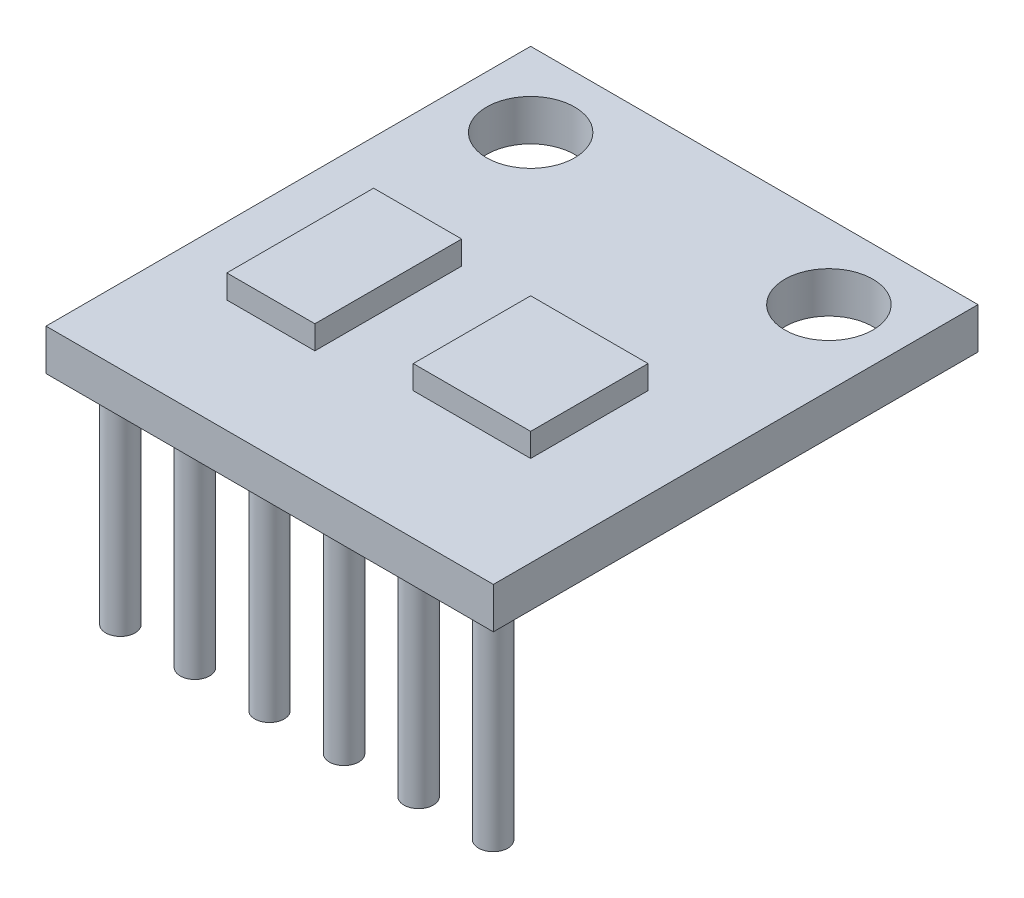
ISO-10303-21;
HEADER;
FILE_DESCRIPTION(('STEP AP214'),'2;1');
FILE_NAME('part.step','',(''),(''),'','','');
FILE_SCHEMA(('AUTOMOTIVE_DESIGN { 1 0 10303 214 1 1 1 1 }'));
ENDSEC;
DATA;
#1=APPLICATION_CONTEXT('core data for automotive mechanical design processes');
#2=APPLICATION_PROTOCOL_DEFINITION('international standard','automotive_design',2000,#1);
#3=PRODUCT_CONTEXT('',#1,'mechanical');
#4=PRODUCT('Part','Part','',(#3));
#5=PRODUCT_RELATED_PRODUCT_CATEGORY('part','',(#4));
#6=PRODUCT_DEFINITION_FORMATION('','',#4);
#7=PRODUCT_DEFINITION_CONTEXT('part definition',#1,'design');
#8=PRODUCT_DEFINITION('design','',#6,#7);
#9=PRODUCT_DEFINITION_SHAPE('','',#8);
#10=(LENGTH_UNIT() NAMED_UNIT(*) SI_UNIT(.MILLI.,.METRE.));
#11=(NAMED_UNIT(*) PLANE_ANGLE_UNIT() SI_UNIT($,.RADIAN.));
#12=(NAMED_UNIT(*) SI_UNIT($,.STERADIAN.) SOLID_ANGLE_UNIT());
#13=UNCERTAINTY_MEASURE_WITH_UNIT(LENGTH_MEASURE(1.E-05),#10,'distance_accuracy_value','');
#14=(GEOMETRIC_REPRESENTATION_CONTEXT(3) GLOBAL_UNCERTAINTY_ASSIGNED_CONTEXT((#13)) GLOBAL_UNIT_ASSIGNED_CONTEXT((#10,
#11,#12)) REPRESENTATION_CONTEXT('',''));
#15=CARTESIAN_POINT('',(0.,0.,0.));
#16=DIRECTION('',(0.,0.,1.));
#17=DIRECTION('',(1.,0.,0.));
#18=AXIS2_PLACEMENT_3D('',#15,#16,#17);
#19=CARTESIAN_POINT('',(0.,0.,0.));
#20=DIRECTION('',(0.,1.,0.));
#21=DIRECTION('',(0.,0.,1.));
#22=AXIS2_PLACEMENT_3D('',#19,#20,#21);
#23=PLANE('',#22);
#24=CARTESIAN_POINT('',(3.8004132231405,0.,4.06430762171794));
#25=DIRECTION('',(0.,1.,0.));
#26=DIRECTION('',(0.,0.,1.));
#27=AXIS2_PLACEMENT_3D('',#24,#25,#26);
#28=CIRCLE('',#27,0.500000000000001);
#29=CARTESIAN_POINT('',(3.8004132231405,0.,4.56430762171794));
#30=VERTEX_POINT('',#29);
#31=EDGE_CURVE('E40',#30,#30,#28,.F.);
#32=ORIENTED_EDGE('',*,*,#31,.F.);
#33=EDGE_LOOP('',(#32));
#34=FACE_BOUND('',#33,.T.);
#35=CARTESIAN_POINT('',(-1.2795867768595,0.,4.06430762171794));
#36=DIRECTION('',(0.,1.,0.));
#37=DIRECTION('',(0.,0.,1.));
#38=AXIS2_PLACEMENT_3D('',#35,#36,#37);
#39=CIRCLE('',#38,0.500000000000001);
#40=CARTESIAN_POINT('',(-1.2795867768595,0.,4.56430762171794));
#41=VERTEX_POINT('',#40);
#42=EDGE_CURVE('E226',#41,#41,#39,.F.);
#43=ORIENTED_EDGE('',*,*,#42,.F.);
#44=EDGE_LOOP('',(#43));
#45=FACE_BOUND('',#44,.T.);
#46=CARTESIAN_POINT('',(-6.3595867768595,0.,4.06430762171794));
#47=DIRECTION('',(0.,1.,0.));
#48=DIRECTION('',(0.,0.,1.));
#49=AXIS2_PLACEMENT_3D('',#46,#47,#48);
#50=CIRCLE('',#49,0.500000000000001);
#51=CARTESIAN_POINT('',(-6.3595867768595,0.,4.56430762171794));
#52=VERTEX_POINT('',#51);
#53=EDGE_CURVE('E220',#52,#52,#50,.F.);
#54=ORIENTED_EDGE('',*,*,#53,.F.);
#55=EDGE_LOOP('',(#54));
#56=FACE_BOUND('',#55,.T.);
#57=CARTESIAN_POINT('',(-5.0895867768595,0.,-8.64183195592286));
#58=DIRECTION('',(0.,1.,0.));
#59=DIRECTION('',(0.,0.,1.));
#60=AXIS2_PLACEMENT_3D('',#57,#58,#59);
#61=CIRCLE('',#60,1.5);
#62=CARTESIAN_POINT('',(-5.0895867768595,0.,-7.14183195592287));
#63=VERTEX_POINT('',#62);
#64=EDGE_CURVE('E182',#63,#63,#61,.T.);
#65=ORIENTED_EDGE('',*,*,#64,.T.);
#66=EDGE_LOOP('',(#65));
#67=FACE_BOUND('',#66,.T.);
#68=DIRECTION('',(0.,0.,-1.));
#69=VECTOR('',#68,1.);
#70=CARTESIAN_POINT('',(7.6104132231405,0.,5.32816804407714));
#71=LINE('',#70,#69);
#72=CARTESIAN_POINT('',(7.6104132231405,0.,5.32816804407714));
#73=VERTEX_POINT('',#72);
#74=CARTESIAN_POINT('',(7.6104132231405,0.,-11.1818319559229));
#75=VERTEX_POINT('',#74);
#76=EDGE_CURVE('E188',#73,#75,#71,.T.);
#77=ORIENTED_EDGE('',*,*,#76,.F.);
#78=DIRECTION('',(1.,0.,0.));
#79=VECTOR('',#78,1.);
#80=CARTESIAN_POINT('',(7.6104132231405,0.,5.32816804407714));
#81=LINE('',#80,#79);
#82=CARTESIAN_POINT('',(-7.62958677685951,0.,5.32816804407714));
#83=VERTEX_POINT('',#82);
#84=EDGE_CURVE('E195',#83,#73,#81,.T.);
#85=ORIENTED_EDGE('',*,*,#84,.F.);
#86=DIRECTION('',(0.,0.,1.));
#87=VECTOR('',#86,1.);
#88=CARTESIAN_POINT('',(-7.62958677685951,0.,5.32816804407714));
#89=LINE('',#88,#87);
#90=CARTESIAN_POINT('',(-7.6295867768595,0.,-11.1818319559229));
#91=VERTEX_POINT('',#90);
#92=EDGE_CURVE('E206',#91,#83,#89,.T.);
#93=ORIENTED_EDGE('',*,*,#92,.F.);
#94=DIRECTION('',(-1.,0.,0.));
#95=VECTOR('',#94,1.);
#96=CARTESIAN_POINT('',(7.6104132231405,0.,-11.1818319559229));
#97=LINE('',#96,#95);
#98=EDGE_CURVE('E204',#75,#91,#97,.T.);
#99=ORIENTED_EDGE('',*,*,#98,.F.);
#100=EDGE_LOOP('',(#77,#85,#93,#99));
#101=FACE_BOUND('',#100,.T.);
#102=CARTESIAN_POINT('',(5.07041322314049,0.,-8.64183195592287));
#103=DIRECTION('',(0.,1.,0.));
#104=DIRECTION('',(0.,0.,1.));
#105=AXIS2_PLACEMENT_3D('',#102,#103,#104);
#106=CIRCLE('',#105,1.5);
#107=CARTESIAN_POINT('',(5.07041322314049,0.,-7.14183195592287));
#108=VERTEX_POINT('',#107);
#109=EDGE_CURVE('E178',#108,#108,#106,.T.);
#110=ORIENTED_EDGE('',*,*,#109,.T.);
#111=EDGE_LOOP('',(#110));
#112=FACE_BOUND('',#111,.T.);
#113=CARTESIAN_POINT('',(-3.8195867768595,0.,4.06430762171794));
#114=DIRECTION('',(0.,1.,0.));
#115=DIRECTION('',(0.,0.,1.));
#116=AXIS2_PLACEMENT_3D('',#113,#114,#115);
#117=CIRCLE('',#116,0.500000000000001);
#118=CARTESIAN_POINT('',(-3.8195867768595,0.,4.56430762171794));
#119=VERTEX_POINT('',#118);
#120=EDGE_CURVE('E223',#119,#119,#117,.F.);
#121=ORIENTED_EDGE('',*,*,#120,.F.);
#122=EDGE_LOOP('',(#121));
#123=FACE_BOUND('',#122,.T.);
#124=CARTESIAN_POINT('',(1.2604132231405,0.,4.06430762171794));
#125=DIRECTION('',(0.,1.,0.));
#126=DIRECTION('',(0.,0.,1.));
#127=AXIS2_PLACEMENT_3D('',#124,#125,#126);
#128=CIRCLE('',#127,0.500000000000001);
#129=CARTESIAN_POINT('',(1.2604132231405,0.,4.56430762171794));
#130=VERTEX_POINT('',#129);
#131=EDGE_CURVE('E229',#130,#130,#128,.F.);
#132=ORIENTED_EDGE('',*,*,#131,.F.);
#133=EDGE_LOOP('',(#132));
#134=FACE_BOUND('',#133,.T.);
#135=CARTESIAN_POINT('',(6.3404132231405,0.,4.06430762171794));
#136=DIRECTION('',(0.,1.,0.));
#137=DIRECTION('',(0.,0.,1.));
#138=AXIS2_PLACEMENT_3D('',#135,#136,#137);
#139=CIRCLE('',#138,0.500000000000001);
#140=CARTESIAN_POINT('',(6.3404132231405,0.,4.56430762171794));
#141=VERTEX_POINT('',#140);
#142=EDGE_CURVE('E11',#141,#141,#139,.F.);
#143=ORIENTED_EDGE('',*,*,#142,.F.);
#144=EDGE_LOOP('',(#143));
#145=FACE_BOUND('',#144,.T.);
#146=ADVANCED_FACE('F32',(#34,#45,#56,#67,#101,#112,#123,#134,#145),#23,.F.);
#147=CARTESIAN_POINT('',(0.,1.4,0.));
#148=DIRECTION('',(0.,1.,0.));
#149=DIRECTION('',(0.,0.,1.));
#150=AXIS2_PLACEMENT_3D('',#147,#148,#149);
#151=PLANE('',#150);
#152=DIRECTION('',(1.,0.,0.));
#153=VECTOR('',#152,1.);
#154=CARTESIAN_POINT('',(-2.3195867768595,1.4,1.47816804407714));
#155=LINE('',#154,#153);
#156=CARTESIAN_POINT('',(-5.3195867768595,1.4,1.47816804407714));
#157=VERTEX_POINT('',#156);
#158=CARTESIAN_POINT('',(-2.3195867768595,1.4,1.47816804407714));
#159=VERTEX_POINT('',#158);
#160=EDGE_CURVE('E150',#157,#159,#155,.T.);
#161=ORIENTED_EDGE('',*,*,#160,.F.);
#162=DIRECTION('',(0.,0.,1.));
#163=VECTOR('',#162,1.);
#164=CARTESIAN_POINT('',(-5.3195867768595,1.4,1.47816804407714));
#165=LINE('',#164,#163);
#166=CARTESIAN_POINT('',(-5.3195867768595,1.4,-3.52183195592286));
#167=VERTEX_POINT('',#166);
#168=EDGE_CURVE('E147',#167,#157,#165,.T.);
#169=ORIENTED_EDGE('',*,*,#168,.F.);
#170=DIRECTION('',(-1.,0.,0.));
#171=VECTOR('',#170,1.);
#172=CARTESIAN_POINT('',(-2.3195867768595,1.4,-3.52183195592286));
#173=LINE('',#172,#171);
#174=CARTESIAN_POINT('',(-2.3195867768595,1.4,-3.52183195592286));
#175=VERTEX_POINT('',#174);
#176=EDGE_CURVE('E159',#175,#167,#173,.T.);
#177=ORIENTED_EDGE('',*,*,#176,.F.);
#178=DIRECTION('',(0.,0.,-1.));
#179=VECTOR('',#178,1.);
#180=CARTESIAN_POINT('',(-2.3195867768595,1.4,1.47816804407714));
#181=LINE('',#180,#179);
#182=EDGE_CURVE('E167',#159,#175,#181,.T.);
#183=ORIENTED_EDGE('',*,*,#182,.F.);
#184=EDGE_LOOP('',(#161,#169,#177,#183));
#185=FACE_BOUND('',#184,.T.);
#186=CARTESIAN_POINT('',(-5.0895867768595,1.4,-8.64183195592286));
#187=DIRECTION('',(0.,1.,0.));
#188=DIRECTION('',(0.,0.,1.));
#189=AXIS2_PLACEMENT_3D('',#186,#187,#188);
#190=CIRCLE('',#189,1.5);
#191=CARTESIAN_POINT('',(-5.0895867768595,1.4,-7.14183195592287));
#192=VERTEX_POINT('',#191);
#193=EDGE_CURVE('E185',#192,#192,#190,.T.);
#194=ORIENTED_EDGE('',*,*,#193,.F.);
#195=EDGE_LOOP('',(#194));
#196=FACE_BOUND('',#195,.T.);
#197=DIRECTION('',(0.,0.,-1.));
#198=VECTOR('',#197,1.);
#199=CARTESIAN_POINT('',(7.6104132231405,1.4,5.32816804407714));
#200=LINE('',#199,#198);
#201=CARTESIAN_POINT('',(7.6104132231405,1.4,5.32816804407714));
#202=VERTEX_POINT('',#201);
#203=CARTESIAN_POINT('',(7.6104132231405,1.4,-11.1818319559229));
#204=VERTEX_POINT('',#203);
#205=EDGE_CURVE('E191',#202,#204,#200,.T.);
#206=ORIENTED_EDGE('',*,*,#205,.T.);
#207=DIRECTION('',(-1.,0.,0.));
#208=VECTOR('',#207,1.);
#209=CARTESIAN_POINT('',(7.6104132231405,1.4,-11.1818319559229));
#210=LINE('',#209,#208);
#211=CARTESIAN_POINT('',(-7.6295867768595,1.4,-11.1818319559229));
#212=VERTEX_POINT('',#211);
#213=EDGE_CURVE('E194',#204,#212,#210,.T.);
#214=ORIENTED_EDGE('',*,*,#213,.T.);
#215=DIRECTION('',(0.,0.,1.));
#216=VECTOR('',#215,1.);
#217=CARTESIAN_POINT('',(-7.62958677685951,1.4,5.32816804407714));
#218=LINE('',#217,#216);
#219=CARTESIAN_POINT('',(-7.62958677685951,1.4,5.32816804407714));
#220=VERTEX_POINT('',#219);
#221=EDGE_CURVE('E197',#212,#220,#218,.T.);
#222=ORIENTED_EDGE('',*,*,#221,.T.);
#223=DIRECTION('',(1.,0.,0.));
#224=VECTOR('',#223,1.);
#225=CARTESIAN_POINT('',(7.6104132231405,1.4,5.32816804407714));
#226=LINE('',#225,#224);
#227=EDGE_CURVE('E199',#220,#202,#226,.T.);
#228=ORIENTED_EDGE('',*,*,#227,.T.);
#229=EDGE_LOOP('',(#206,#214,#222,#228));
#230=FACE_BOUND('',#229,.T.);
#231=CARTESIAN_POINT('',(5.07041322314049,1.4,-8.64183195592287));
#232=DIRECTION('',(0.,1.,0.));
#233=DIRECTION('',(0.,0.,1.));
#234=AXIS2_PLACEMENT_3D('',#231,#232,#233);
#235=CIRCLE('',#234,1.5);
#236=CARTESIAN_POINT('',(5.07041322314049,1.4,-7.14183195592287));
#237=VERTEX_POINT('',#236);
#238=EDGE_CURVE('E179',#237,#237,#235,.T.);
#239=ORIENTED_EDGE('',*,*,#238,.F.);
#240=EDGE_LOOP('',(#239));
#241=FACE_BOUND('',#240,.T.);
#242=DIRECTION('',(1.,0.,0.));
#243=VECTOR('',#242,1.);
#244=CARTESIAN_POINT('',(4.5304132231405,1.4,0.978168044077137));
#245=LINE('',#244,#243);
#246=CARTESIAN_POINT('',(0.530413223140497,1.4,0.978168044077138));
#247=VERTEX_POINT('',#246);
#248=CARTESIAN_POINT('',(4.5304132231405,1.4,0.978168044077137));
#249=VERTEX_POINT('',#248);
#250=EDGE_CURVE('E378',#247,#249,#245,.T.);
#251=ORIENTED_EDGE('',*,*,#250,.F.);
#252=DIRECTION('',(0.,0.,1.));
#253=VECTOR('',#252,1.);
#254=CARTESIAN_POINT('',(0.530413223140497,1.4,0.978168044077138));
#255=LINE('',#254,#253);
#256=CARTESIAN_POINT('',(0.530413223140497,1.4,-3.02183195592286));
#257=VERTEX_POINT('',#256);
#258=EDGE_CURVE('E145',#257,#247,#255,.T.);
#259=ORIENTED_EDGE('',*,*,#258,.F.);
#260=DIRECTION('',(-1.,0.,0.));
#261=VECTOR('',#260,1.);
#262=CARTESIAN_POINT('',(4.5304132231405,1.4,-3.02183195592286));
#263=LINE('',#262,#261);
#264=CARTESIAN_POINT('',(4.5304132231405,1.4,-3.02183195592286));
#265=VERTEX_POINT('',#264);
#266=EDGE_CURVE('E141',#265,#257,#263,.T.);
#267=ORIENTED_EDGE('',*,*,#266,.F.);
#268=DIRECTION('',(0.,0.,-1.));
#269=VECTOR('',#268,1.);
#270=CARTESIAN_POINT('',(4.5304132231405,1.4,0.978168044077137));
#271=LINE('',#270,#269);
#272=EDGE_CURVE('E380',#249,#265,#271,.T.);
#273=ORIENTED_EDGE('',*,*,#272,.F.);
#274=EDGE_LOOP('',(#251,#259,#267,#273));
#275=FACE_BOUND('',#274,.T.);
#276=ADVANCED_FACE('F238',(#185,#196,#230,#241,#275),#151,.T.);
#277=CARTESIAN_POINT('',(7.6104132231405,1.4,5.32816804407714));
#278=DIRECTION('',(-1.,0.,0.));
#279=DIRECTION('',(0.,0.,1.));
#280=AXIS2_PLACEMENT_3D('',#277,#278,#279);
#281=PLANE('',#280);
#282=ORIENTED_EDGE('',*,*,#76,.T.);
#283=DIRECTION('',(0.,-1.,0.));
#284=VECTOR('',#283,1.);
#285=CARTESIAN_POINT('',(7.6104132231405,1.4,-11.1818319559229));
#286=LINE('',#285,#284);
#287=EDGE_CURVE('E217',#204,#75,#286,.T.);
#288=ORIENTED_EDGE('',*,*,#287,.F.);
#289=ORIENTED_EDGE('',*,*,#205,.F.);
#290=DIRECTION('',(0.,-1.,0.));
#291=VECTOR('',#290,1.);
#292=CARTESIAN_POINT('',(7.6104132231405,1.4,5.32816804407714));
#293=LINE('',#292,#291);
#294=EDGE_CURVE('E201',#202,#73,#293,.T.);
#295=ORIENTED_EDGE('',*,*,#294,.T.);
#296=EDGE_LOOP('',(#282,#288,#289,#295));
#297=FACE_BOUND('',#296,.T.);
#298=ADVANCED_FACE('F34',(#297),#281,.F.);
#299=CARTESIAN_POINT('',(7.6104132231405,1.4,-11.1818319559229));
#300=DIRECTION('',(0.,0.,1.));
#301=DIRECTION('',(1.,0.,0.));
#302=AXIS2_PLACEMENT_3D('',#299,#300,#301);
#303=PLANE('',#302);
#304=ORIENTED_EDGE('',*,*,#98,.T.);
#305=DIRECTION('',(0.,-1.,0.));
#306=VECTOR('',#305,1.);
#307=CARTESIAN_POINT('',(-7.6295867768595,1.4,-11.1818319559229));
#308=LINE('',#307,#306);
#309=EDGE_CURVE('E214',#212,#91,#308,.T.);
#310=ORIENTED_EDGE('',*,*,#309,.F.);
#311=ORIENTED_EDGE('',*,*,#213,.F.);
#312=ORIENTED_EDGE('',*,*,#287,.T.);
#313=EDGE_LOOP('',(#304,#310,#311,#312));
#314=FACE_BOUND('',#313,.T.);
#315=ADVANCED_FACE('F357',(#314),#303,.F.);
#316=CARTESIAN_POINT('',(-7.62958677685951,1.4,5.32816804407714));
#317=DIRECTION('',(1.,0.,0.));
#318=DIRECTION('',(0.,0.,-1.));
#319=AXIS2_PLACEMENT_3D('',#316,#317,#318);
#320=PLANE('',#319);
#321=ORIENTED_EDGE('',*,*,#92,.T.);
#322=DIRECTION('',(0.,-1.,0.));
#323=VECTOR('',#322,1.);
#324=CARTESIAN_POINT('',(-7.62958677685951,1.4,5.32816804407714));
#325=LINE('',#324,#323);
#326=EDGE_CURVE('E211',#220,#83,#325,.T.);
#327=ORIENTED_EDGE('',*,*,#326,.F.);
#328=ORIENTED_EDGE('',*,*,#221,.F.);
#329=ORIENTED_EDGE('',*,*,#309,.T.);
#330=EDGE_LOOP('',(#321,#327,#328,#329));
#331=FACE_BOUND('',#330,.T.);
#332=ADVANCED_FACE('F354',(#331),#320,.F.);
#333=CARTESIAN_POINT('',(7.6104132231405,1.4,5.32816804407714));
#334=DIRECTION('',(0.,0.,-1.));
#335=DIRECTION('',(-1.,0.,0.));
#336=AXIS2_PLACEMENT_3D('',#333,#334,#335);
#337=PLANE('',#336);
#338=ORIENTED_EDGE('',*,*,#84,.T.);
#339=ORIENTED_EDGE('',*,*,#294,.F.);
#340=ORIENTED_EDGE('',*,*,#227,.F.);
#341=ORIENTED_EDGE('',*,*,#326,.T.);
#342=EDGE_LOOP('',(#338,#339,#340,#341));
#343=FACE_BOUND('',#342,.T.);
#344=ADVANCED_FACE('F347',(#343),#337,.F.);
#345=CARTESIAN_POINT('',(-5.0895867768595,1.4,-8.64183195592286));
#346=DIRECTION('',(0.,-1.,0.));
#347=DIRECTION('',(0.,0.,-1.));
#348=AXIS2_PLACEMENT_3D('',#345,#346,#347);
#349=CYLINDRICAL_SURFACE('',#348,1.5);
#350=ORIENTED_EDGE('',*,*,#193,.T.);
#351=EDGE_LOOP('',(#350));
#352=FACE_BOUND('',#351,.T.);
#353=ORIENTED_EDGE('',*,*,#64,.F.);
#354=EDGE_LOOP('',(#353));
#355=FACE_BOUND('',#354,.T.);
#356=ADVANCED_FACE('F343',(#352,#355),#349,.F.);
#357=CARTESIAN_POINT('',(5.07041322314049,1.4,-8.64183195592287));
#358=DIRECTION('',(0.,-1.,0.));
#359=DIRECTION('',(0.,0.,-1.));
#360=AXIS2_PLACEMENT_3D('',#357,#358,#359);
#361=CYLINDRICAL_SURFACE('',#360,1.5);
#362=ORIENTED_EDGE('',*,*,#238,.T.);
#363=EDGE_LOOP('',(#362));
#364=FACE_BOUND('',#363,.T.);
#365=ORIENTED_EDGE('',*,*,#109,.F.);
#366=EDGE_LOOP('',(#365));
#367=FACE_BOUND('',#366,.T.);
#368=ADVANCED_FACE('F339',(#364,#367),#361,.F.);
#369=CARTESIAN_POINT('',(-5.3195867768595,2.2,1.47816804407714));
#370=DIRECTION('',(1.,0.,0.));
#371=DIRECTION('',(0.,0.,-1.));
#372=AXIS2_PLACEMENT_3D('',#369,#370,#371);
#373=PLANE('',#372);
#374=ORIENTED_EDGE('',*,*,#168,.T.);
#375=DIRECTION('',(0.,-1.,0.));
#376=VECTOR('',#375,1.);
#377=CARTESIAN_POINT('',(-5.3195867768595,2.2,1.47816804407714));
#378=LINE('',#377,#376);
#379=CARTESIAN_POINT('',(-5.3195867768595,2.2,1.47816804407714));
#380=VERTEX_POINT('',#379);
#381=EDGE_CURVE('E176',#380,#157,#378,.T.);
#382=ORIENTED_EDGE('',*,*,#381,.F.);
#383=DIRECTION('',(0.,0.,1.));
#384=VECTOR('',#383,1.);
#385=CARTESIAN_POINT('',(-5.3195867768595,2.2,1.47816804407714));
#386=LINE('',#385,#384);
#387=CARTESIAN_POINT('',(-5.3195867768595,2.2,-3.52183195592286));
#388=VERTEX_POINT('',#387);
#389=EDGE_CURVE('E155',#388,#380,#386,.T.);
#390=ORIENTED_EDGE('',*,*,#389,.F.);
#391=DIRECTION('',(0.,-1.,0.));
#392=VECTOR('',#391,1.);
#393=CARTESIAN_POINT('',(-5.3195867768595,2.2,-3.52183195592286));
#394=LINE('',#393,#392);
#395=EDGE_CURVE('E164',#388,#167,#394,.T.);
#396=ORIENTED_EDGE('',*,*,#395,.T.);
#397=EDGE_LOOP('',(#374,#382,#390,#396));
#398=FACE_BOUND('',#397,.T.);
#399=ADVANCED_FACE('F335',(#398),#373,.F.);
#400=CARTESIAN_POINT('',(-2.3195867768595,2.2,1.47816804407714));
#401=DIRECTION('',(0.,0.,-1.));
#402=DIRECTION('',(-1.,0.,0.));
#403=AXIS2_PLACEMENT_3D('',#400,#401,#402);
#404=PLANE('',#403);
#405=ORIENTED_EDGE('',*,*,#160,.T.);
#406=DIRECTION('',(0.,-1.,0.));
#407=VECTOR('',#406,1.);
#408=CARTESIAN_POINT('',(-2.3195867768595,2.2,1.47816804407714));
#409=LINE('',#408,#407);
#410=CARTESIAN_POINT('',(-2.3195867768595,2.2,1.47816804407714));
#411=VERTEX_POINT('',#410);
#412=EDGE_CURVE('E173',#411,#159,#409,.T.);
#413=ORIENTED_EDGE('',*,*,#412,.F.);
#414=DIRECTION('',(1.,0.,0.));
#415=VECTOR('',#414,1.);
#416=CARTESIAN_POINT('',(-2.3195867768595,2.2,1.47816804407714));
#417=LINE('',#416,#415);
#418=EDGE_CURVE('E158',#380,#411,#417,.T.);
#419=ORIENTED_EDGE('',*,*,#418,.F.);
#420=ORIENTED_EDGE('',*,*,#381,.T.);
#421=EDGE_LOOP('',(#405,#413,#419,#420));
#422=FACE_BOUND('',#421,.T.);
#423=ADVANCED_FACE('F331',(#422),#404,.F.);
#424=CARTESIAN_POINT('',(-2.3195867768595,2.2,1.47816804407714));
#425=DIRECTION('',(-1.,0.,0.));
#426=DIRECTION('',(0.,0.,1.));
#427=AXIS2_PLACEMENT_3D('',#424,#425,#426);
#428=PLANE('',#427);
#429=ORIENTED_EDGE('',*,*,#182,.T.);
#430=DIRECTION('',(0.,-1.,0.));
#431=VECTOR('',#430,1.);
#432=CARTESIAN_POINT('',(-2.3195867768595,2.2,-3.52183195592286));
#433=LINE('',#432,#431);
#434=CARTESIAN_POINT('',(-2.3195867768595,2.2,-3.52183195592286));
#435=VERTEX_POINT('',#434);
#436=EDGE_CURVE('E55',#435,#175,#433,.T.);
#437=ORIENTED_EDGE('',*,*,#436,.F.);
#438=DIRECTION('',(0.,0.,-1.));
#439=VECTOR('',#438,1.);
#440=CARTESIAN_POINT('',(-2.3195867768595,2.2,1.47816804407714));
#441=LINE('',#440,#439);
#442=EDGE_CURVE('E161',#411,#435,#441,.T.);
#443=ORIENTED_EDGE('',*,*,#442,.F.);
#444=ORIENTED_EDGE('',*,*,#412,.T.);
#445=EDGE_LOOP('',(#429,#437,#443,#444));
#446=FACE_BOUND('',#445,.T.);
#447=ADVANCED_FACE('F328',(#446),#428,.F.);
#448=CARTESIAN_POINT('',(-2.3195867768595,2.2,-3.52183195592286));
#449=DIRECTION('',(0.,0.,1.));
#450=DIRECTION('',(1.,0.,0.));
#451=AXIS2_PLACEMENT_3D('',#448,#449,#450);
#452=PLANE('',#451);
#453=ORIENTED_EDGE('',*,*,#176,.T.);
#454=ORIENTED_EDGE('',*,*,#395,.F.);
#455=DIRECTION('',(-1.,0.,0.));
#456=VECTOR('',#455,1.);
#457=CARTESIAN_POINT('',(-2.3195867768595,2.2,-3.52183195592286));
#458=LINE('',#457,#456);
#459=EDGE_CURVE('E163',#435,#388,#458,.T.);
#460=ORIENTED_EDGE('',*,*,#459,.F.);
#461=ORIENTED_EDGE('',*,*,#436,.T.);
#462=EDGE_LOOP('',(#453,#454,#460,#461));
#463=FACE_BOUND('',#462,.T.);
#464=ADVANCED_FACE('F324',(#463),#452,.F.);
#465=CARTESIAN_POINT('',(0.,2.2,0.));
#466=DIRECTION('',(0.,1.,0.));
#467=DIRECTION('',(0.,0.,1.));
#468=AXIS2_PLACEMENT_3D('',#465,#466,#467);
#469=PLANE('',#468);
#470=ORIENTED_EDGE('',*,*,#389,.T.);
#471=ORIENTED_EDGE('',*,*,#418,.T.);
#472=ORIENTED_EDGE('',*,*,#442,.T.);
#473=ORIENTED_EDGE('',*,*,#459,.T.);
#474=EDGE_LOOP('',(#470,#471,#472,#473));
#475=FACE_BOUND('',#474,.T.);
#476=ADVANCED_FACE('F321',(#475),#469,.T.);
#477=CARTESIAN_POINT('',(0.530413223140497,2.2,0.978168044077138));
#478=DIRECTION('',(1.,0.,0.));
#479=DIRECTION('',(0.,0.,-1.));
#480=AXIS2_PLACEMENT_3D('',#477,#478,#479);
#481=PLANE('',#480);
#482=ORIENTED_EDGE('',*,*,#258,.T.);
#483=DIRECTION('',(0.,-1.,0.));
#484=VECTOR('',#483,1.);
#485=CARTESIAN_POINT('',(0.530413223140497,2.2,0.978168044077138));
#486=LINE('',#485,#484);
#487=CARTESIAN_POINT('',(0.530413223140497,2.2,0.978168044077138));
#488=VERTEX_POINT('',#487);
#489=EDGE_CURVE('E126',#488,#247,#486,.T.);
#490=ORIENTED_EDGE('',*,*,#489,.F.);
#491=DIRECTION('',(0.,0.,1.));
#492=VECTOR('',#491,1.);
#493=CARTESIAN_POINT('',(0.530413223140497,2.2,0.978168044077138));
#494=LINE('',#493,#492);
#495=CARTESIAN_POINT('',(0.530413223140497,2.2,-3.02183195592286));
#496=VERTEX_POINT('',#495);
#497=EDGE_CURVE('E133',#496,#488,#494,.T.);
#498=ORIENTED_EDGE('',*,*,#497,.F.);
#499=DIRECTION('',(0.,-1.,0.));
#500=VECTOR('',#499,1.);
#501=CARTESIAN_POINT('',(0.530413223140497,2.2,-3.02183195592286));
#502=LINE('',#501,#500);
#503=EDGE_CURVE('E388',#496,#257,#502,.T.);
#504=ORIENTED_EDGE('',*,*,#503,.T.);
#505=EDGE_LOOP('',(#482,#490,#498,#504));
#506=FACE_BOUND('',#505,.T.);
#507=ADVANCED_FACE('F143',(#506),#481,.F.);
#508=CARTESIAN_POINT('',(4.5304132231405,2.2,0.978168044077137));
#509=DIRECTION('',(0.,0.,-1.));
#510=DIRECTION('',(-1.,0.,0.));
#511=AXIS2_PLACEMENT_3D('',#508,#509,#510);
#512=PLANE('',#511);
#513=ORIENTED_EDGE('',*,*,#250,.T.);
#514=DIRECTION('',(0.,-1.,0.));
#515=VECTOR('',#514,1.);
#516=CARTESIAN_POINT('',(4.5304132231405,2.2,0.978168044077137));
#517=LINE('',#516,#515);
#518=CARTESIAN_POINT('',(4.5304132231405,2.2,0.978168044077137));
#519=VERTEX_POINT('',#518);
#520=EDGE_CURVE('E129',#519,#249,#517,.T.);
#521=ORIENTED_EDGE('',*,*,#520,.F.);
#522=DIRECTION('',(1.,0.,0.));
#523=VECTOR('',#522,1.);
#524=CARTESIAN_POINT('',(4.5304132231405,2.2,0.978168044077137));
#525=LINE('',#524,#523);
#526=EDGE_CURVE('E122',#488,#519,#525,.T.);
#527=ORIENTED_EDGE('',*,*,#526,.F.);
#528=ORIENTED_EDGE('',*,*,#489,.T.);
#529=EDGE_LOOP('',(#513,#521,#527,#528));
#530=FACE_BOUND('',#529,.T.);
#531=ADVANCED_FACE('F124',(#530),#512,.F.);
#532=CARTESIAN_POINT('',(4.5304132231405,2.2,0.978168044077137));
#533=DIRECTION('',(-1.,0.,0.));
#534=DIRECTION('',(0.,0.,1.));
#535=AXIS2_PLACEMENT_3D('',#532,#533,#534);
#536=PLANE('',#535);
#537=ORIENTED_EDGE('',*,*,#272,.T.);
#538=DIRECTION('',(0.,-1.,0.));
#539=VECTOR('',#538,1.);
#540=CARTESIAN_POINT('',(4.5304132231405,2.2,-3.02183195592286));
#541=LINE('',#540,#539);
#542=CARTESIAN_POINT('',(4.5304132231405,2.2,-3.02183195592286));
#543=VERTEX_POINT('',#542);
#544=EDGE_CURVE('E47',#543,#265,#541,.T.);
#545=ORIENTED_EDGE('',*,*,#544,.F.);
#546=DIRECTION('',(0.,0.,-1.));
#547=VECTOR('',#546,1.);
#548=CARTESIAN_POINT('',(4.5304132231405,2.2,0.978168044077137));
#549=LINE('',#548,#547);
#550=EDGE_CURVE('E132',#519,#543,#549,.T.);
#551=ORIENTED_EDGE('',*,*,#550,.F.);
#552=ORIENTED_EDGE('',*,*,#520,.T.);
#553=EDGE_LOOP('',(#537,#545,#551,#552));
#554=FACE_BOUND('',#553,.T.);
#555=ADVANCED_FACE('F313',(#554),#536,.F.);
#556=CARTESIAN_POINT('',(4.5304132231405,2.2,-3.02183195592286));
#557=DIRECTION('',(0.,0.,1.));
#558=DIRECTION('',(1.,0.,0.));
#559=AXIS2_PLACEMENT_3D('',#556,#557,#558);
#560=PLANE('',#559);
#561=ORIENTED_EDGE('',*,*,#266,.T.);
#562=ORIENTED_EDGE('',*,*,#503,.F.);
#563=DIRECTION('',(-1.,0.,0.));
#564=VECTOR('',#563,1.);
#565=CARTESIAN_POINT('',(4.5304132231405,2.2,-3.02183195592286));
#566=LINE('',#565,#564);
#567=EDGE_CURVE('E137',#543,#496,#566,.T.);
#568=ORIENTED_EDGE('',*,*,#567,.F.);
#569=ORIENTED_EDGE('',*,*,#544,.T.);
#570=EDGE_LOOP('',(#561,#562,#568,#569));
#571=FACE_BOUND('',#570,.T.);
#572=ADVANCED_FACE('F310',(#571),#560,.F.);
#573=CARTESIAN_POINT('',(0.,2.2,0.));
#574=DIRECTION('',(0.,1.,0.));
#575=DIRECTION('',(0.,0.,1.));
#576=AXIS2_PLACEMENT_3D('',#573,#574,#575);
#577=PLANE('',#576);
#578=ORIENTED_EDGE('',*,*,#497,.T.);
#579=ORIENTED_EDGE('',*,*,#526,.T.);
#580=ORIENTED_EDGE('',*,*,#550,.T.);
#581=ORIENTED_EDGE('',*,*,#567,.T.);
#582=EDGE_LOOP('',(#578,#579,#580,#581));
#583=FACE_BOUND('',#582,.T.);
#584=ADVANCED_FACE('F136',(#583),#577,.T.);
#585=CARTESIAN_POINT('',(-6.3595867768595,-7.4,4.06430762171794));
#586=DIRECTION('',(0.,1.,0.));
#587=DIRECTION('',(0.,0.,1.));
#588=AXIS2_PLACEMENT_3D('',#585,#586,#587);
#589=CYLINDRICAL_SURFACE('',#588,0.500000000000001);
#590=CARTESIAN_POINT('',(-6.3595867768595,-7.4,4.06430762171794));
#591=DIRECTION('',(0.,-1.,0.));
#592=DIRECTION('',(0.,0.,-1.));
#593=AXIS2_PLACEMENT_3D('',#590,#591,#592);
#594=CIRCLE('',#593,0.500000000000001);
#595=CARTESIAN_POINT('',(-6.3595867768595,-7.4,3.56430762171794));
#596=VERTEX_POINT('',#595);
#597=EDGE_CURVE('E383',#596,#596,#594,.T.);
#598=ORIENTED_EDGE('',*,*,#597,.F.);
#599=EDGE_LOOP('',(#598));
#600=FACE_BOUND('',#599,.T.);
#601=ORIENTED_EDGE('',*,*,#53,.T.);
#602=EDGE_LOOP('',(#601));
#603=FACE_BOUND('',#602,.T.);
#604=ADVANCED_FACE('F303',(#600,#603),#589,.T.);
#605=CARTESIAN_POINT('',(-6.3595867768595,-7.4,4.06430762171794));
#606=DIRECTION('',(0.,-1.,0.));
#607=DIRECTION('',(0.,0.,-1.));
#608=AXIS2_PLACEMENT_3D('',#605,#606,#607);
#609=PLANE('',#608);
#610=ORIENTED_EDGE('',*,*,#597,.T.);
#611=EDGE_LOOP('',(#610));
#612=FACE_BOUND('',#611,.T.);
#613=ADVANCED_FACE('F299',(#612),#609,.T.);
#614=CARTESIAN_POINT('',(-3.8195867768595,-7.4,4.06430762171794));
#615=DIRECTION('',(0.,1.,0.));
#616=DIRECTION('',(0.,0.,1.));
#617=AXIS2_PLACEMENT_3D('',#614,#615,#616);
#618=CYLINDRICAL_SURFACE('',#617,0.500000000000001);
#619=CARTESIAN_POINT('',(-3.8195867768595,-7.4,4.06430762171794));
#620=DIRECTION('',(0.,-1.,0.));
#621=DIRECTION('',(0.,0.,-1.));
#622=AXIS2_PLACEMENT_3D('',#619,#620,#621);
#623=CIRCLE('',#622,0.500000000000001);
#624=CARTESIAN_POINT('',(-3.8195867768595,-7.4,3.56430762171794));
#625=VERTEX_POINT('',#624);
#626=EDGE_CURVE('E393',#625,#625,#623,.T.);
#627=ORIENTED_EDGE('',*,*,#626,.F.);
#628=EDGE_LOOP('',(#627));
#629=FACE_BOUND('',#628,.T.);
#630=ORIENTED_EDGE('',*,*,#120,.T.);
#631=EDGE_LOOP('',(#630));
#632=FACE_BOUND('',#631,.T.);
#633=ADVANCED_FACE('F295',(#629,#632),#618,.T.);
#634=CARTESIAN_POINT('',(-3.8195867768595,-7.4,4.06430762171794));
#635=DIRECTION('',(0.,-1.,0.));
#636=DIRECTION('',(0.,0.,-1.));
#637=AXIS2_PLACEMENT_3D('',#634,#635,#636);
#638=PLANE('',#637);
#639=ORIENTED_EDGE('',*,*,#626,.T.);
#640=EDGE_LOOP('',(#639));
#641=FACE_BOUND('',#640,.T.);
#642=ADVANCED_FACE('F291',(#641),#638,.T.);
#643=CARTESIAN_POINT('',(-1.2795867768595,-7.4,4.06430762171794));
#644=DIRECTION('',(0.,1.,0.));
#645=DIRECTION('',(0.,0.,1.));
#646=AXIS2_PLACEMENT_3D('',#643,#644,#645);
#647=CYLINDRICAL_SURFACE('',#646,0.500000000000001);
#648=CARTESIAN_POINT('',(-1.2795867768595,-7.4,4.06430762171794));
#649=DIRECTION('',(0.,-1.,0.));
#650=DIRECTION('',(0.,0.,-1.));
#651=AXIS2_PLACEMENT_3D('',#648,#649,#650);
#652=CIRCLE('',#651,0.500000000000001);
#653=CARTESIAN_POINT('',(-1.2795867768595,-7.4,3.56430762171794));
#654=VERTEX_POINT('',#653);
#655=EDGE_CURVE('E396',#654,#654,#652,.T.);
#656=ORIENTED_EDGE('',*,*,#655,.F.);
#657=EDGE_LOOP('',(#656));
#658=FACE_BOUND('',#657,.T.);
#659=ORIENTED_EDGE('',*,*,#42,.T.);
#660=EDGE_LOOP('',(#659));
#661=FACE_BOUND('',#660,.T.);
#662=ADVANCED_FACE('F287',(#658,#661),#647,.T.);
#663=CARTESIAN_POINT('',(-1.2795867768595,-7.4,4.06430762171794));
#664=DIRECTION('',(0.,-1.,0.));
#665=DIRECTION('',(0.,0.,-1.));
#666=AXIS2_PLACEMENT_3D('',#663,#664,#665);
#667=PLANE('',#666);
#668=ORIENTED_EDGE('',*,*,#655,.T.);
#669=EDGE_LOOP('',(#668));
#670=FACE_BOUND('',#669,.T.);
#671=ADVANCED_FACE('F283',(#670),#667,.T.);
#672=CARTESIAN_POINT('',(1.2604132231405,-7.4,4.06430762171794));
#673=DIRECTION('',(0.,1.,0.));
#674=DIRECTION('',(0.,0.,1.));
#675=AXIS2_PLACEMENT_3D('',#672,#673,#674);
#676=CYLINDRICAL_SURFACE('',#675,0.500000000000001);
#677=CARTESIAN_POINT('',(1.2604132231405,-7.4,4.06430762171794));
#678=DIRECTION('',(0.,-1.,0.));
#679=DIRECTION('',(0.,0.,-1.));
#680=AXIS2_PLACEMENT_3D('',#677,#678,#679);
#681=CIRCLE('',#680,0.500000000000001);
#682=CARTESIAN_POINT('',(1.2604132231405,-7.4,3.56430762171794));
#683=VERTEX_POINT('',#682);
#684=EDGE_CURVE('E399',#683,#683,#681,.T.);
#685=ORIENTED_EDGE('',*,*,#684,.F.);
#686=EDGE_LOOP('',(#685));
#687=FACE_BOUND('',#686,.T.);
#688=ORIENTED_EDGE('',*,*,#131,.T.);
#689=EDGE_LOOP('',(#688));
#690=FACE_BOUND('',#689,.T.);
#691=ADVANCED_FACE('F279',(#687,#690),#676,.T.);
#692=CARTESIAN_POINT('',(1.2604132231405,-7.4,4.06430762171794));
#693=DIRECTION('',(0.,-1.,0.));
#694=DIRECTION('',(0.,0.,-1.));
#695=AXIS2_PLACEMENT_3D('',#692,#693,#694);
#696=PLANE('',#695);
#697=ORIENTED_EDGE('',*,*,#684,.T.);
#698=EDGE_LOOP('',(#697));
#699=FACE_BOUND('',#698,.T.);
#700=ADVANCED_FACE('F275',(#699),#696,.T.);
#701=CARTESIAN_POINT('',(3.8004132231405,-7.4,4.06430762171794));
#702=DIRECTION('',(0.,1.,0.));
#703=DIRECTION('',(0.,0.,1.));
#704=AXIS2_PLACEMENT_3D('',#701,#702,#703);
#705=CYLINDRICAL_SURFACE('',#704,0.500000000000001);
#706=CARTESIAN_POINT('',(3.8004132231405,-7.4,4.06430762171794));
#707=DIRECTION('',(0.,-1.,0.));
#708=DIRECTION('',(0.,0.,-1.));
#709=AXIS2_PLACEMENT_3D('',#706,#707,#708);
#710=CIRCLE('',#709,0.500000000000001);
#711=CARTESIAN_POINT('',(3.8004132231405,-7.4,3.56430762171794));
#712=VERTEX_POINT('',#711);
#713=EDGE_CURVE('E402',#712,#712,#710,.T.);
#714=ORIENTED_EDGE('',*,*,#713,.F.);
#715=EDGE_LOOP('',(#714));
#716=FACE_BOUND('',#715,.T.);
#717=ORIENTED_EDGE('',*,*,#31,.T.);
#718=EDGE_LOOP('',(#717));
#719=FACE_BOUND('',#718,.T.);
#720=ADVANCED_FACE('F234',(#716,#719),#705,.T.);
#721=CARTESIAN_POINT('',(3.8004132231405,-7.4,4.06430762171794));
#722=DIRECTION('',(0.,-1.,0.));
#723=DIRECTION('',(0.,0.,-1.));
#724=AXIS2_PLACEMENT_3D('',#721,#722,#723);
#725=PLANE('',#724);
#726=ORIENTED_EDGE('',*,*,#713,.T.);
#727=EDGE_LOOP('',(#726));
#728=FACE_BOUND('',#727,.T.);
#729=ADVANCED_FACE('F260',(#728),#725,.T.);
#730=CARTESIAN_POINT('',(6.3404132231405,-7.4,4.06430762171794));
#731=DIRECTION('',(0.,1.,0.));
#732=DIRECTION('',(0.,0.,1.));
#733=AXIS2_PLACEMENT_3D('',#730,#731,#732);
#734=CYLINDRICAL_SURFACE('',#733,0.500000000000001);
#735=CARTESIAN_POINT('',(6.3404132231405,-7.4,4.06430762171794));
#736=DIRECTION('',(0.,-1.,0.));
#737=DIRECTION('',(0.,0.,-1.));
#738=AXIS2_PLACEMENT_3D('',#735,#736,#737);
#739=CIRCLE('',#738,0.500000000000001);
#740=CARTESIAN_POINT('',(6.3404132231405,-7.4,3.56430762171794));
#741=VERTEX_POINT('',#740);
#742=EDGE_CURVE('E405',#741,#741,#739,.T.);
#743=ORIENTED_EDGE('',*,*,#742,.F.);
#744=EDGE_LOOP('',(#743));
#745=FACE_BOUND('',#744,.T.);
#746=ORIENTED_EDGE('',*,*,#142,.T.);
#747=EDGE_LOOP('',(#746));
#748=FACE_BOUND('',#747,.T.);
#749=ADVANCED_FACE('F257',(#745,#748),#734,.T.);
#750=CARTESIAN_POINT('',(6.3404132231405,-7.4,4.06430762171794));
#751=DIRECTION('',(0.,-1.,0.));
#752=DIRECTION('',(0.,0.,-1.));
#753=AXIS2_PLACEMENT_3D('',#750,#751,#752);
#754=PLANE('',#753);
#755=ORIENTED_EDGE('',*,*,#742,.T.);
#756=EDGE_LOOP('',(#755));
#757=FACE_BOUND('',#756,.T.);
#758=ADVANCED_FACE('F259',(#757),#754,.T.);
#759=CLOSED_SHELL('',(#146,#276,#298,#315,#332,#344,#356,#368,#399,#423,#447,#464,#476,#507,
#531,#555,#572,#584,#604,#613,#633,#642,#662,#671,#691,#700,#720,#729,#749,#758));
#760=MANIFOLD_SOLID_BREP('B2',#759);
#761=ADVANCED_BREP_SHAPE_REPRESENTATION('',(#18,#760),#14);
#762=SHAPE_DEFINITION_REPRESENTATION(#9,#761);
ENDSEC;
END-ISO-10303-21;
